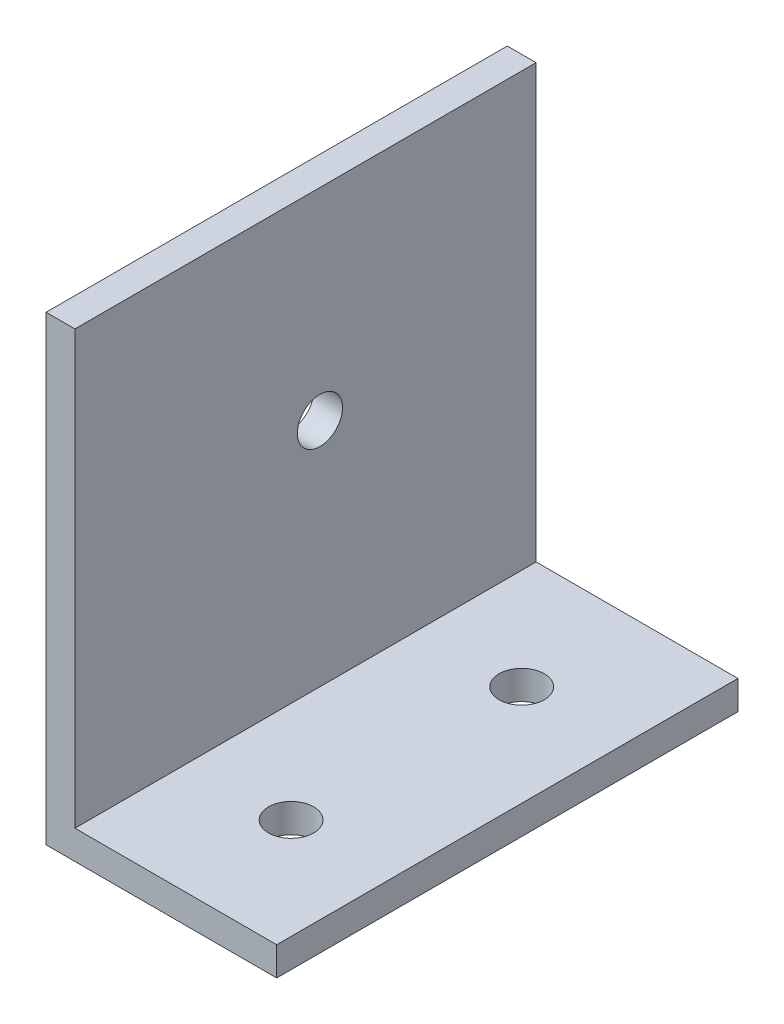
ISO-10303-21;
HEADER;
FILE_DESCRIPTION(('STEP AP214'),'2;1');
FILE_NAME('part.step','',(''),(''),'','','');
FILE_SCHEMA(('AUTOMOTIVE_DESIGN { 1 0 10303 214 1 1 1 1 }'));
ENDSEC;
DATA;
#1=APPLICATION_CONTEXT('core data for automotive mechanical design processes');
#2=APPLICATION_PROTOCOL_DEFINITION('international standard','automotive_design',2000,#1);
#3=PRODUCT_CONTEXT('',#1,'mechanical');
#4=PRODUCT('Part','Part','',(#3));
#5=PRODUCT_RELATED_PRODUCT_CATEGORY('part','',(#4));
#6=PRODUCT_DEFINITION_FORMATION('','',#4);
#7=PRODUCT_DEFINITION_CONTEXT('part definition',#1,'design');
#8=PRODUCT_DEFINITION('design','',#6,#7);
#9=PRODUCT_DEFINITION_SHAPE('','',#8);
#10=(LENGTH_UNIT() NAMED_UNIT(*) SI_UNIT(.MILLI.,.METRE.));
#11=(NAMED_UNIT(*) PLANE_ANGLE_UNIT() SI_UNIT($,.RADIAN.));
#12=(NAMED_UNIT(*) SI_UNIT($,.STERADIAN.) SOLID_ANGLE_UNIT());
#13=UNCERTAINTY_MEASURE_WITH_UNIT(LENGTH_MEASURE(1.E-05),#10,'distance_accuracy_value','');
#14=(GEOMETRIC_REPRESENTATION_CONTEXT(3) GLOBAL_UNCERTAINTY_ASSIGNED_CONTEXT((#13)) GLOBAL_UNIT_ASSIGNED_CONTEXT((#10,
#11,#12)) REPRESENTATION_CONTEXT('',''));
#15=CARTESIAN_POINT('',(0.,0.,0.));
#16=DIRECTION('',(0.,0.,1.));
#17=DIRECTION('',(1.,0.,0.));
#18=AXIS2_PLACEMENT_3D('',#15,#16,#17);
#19=CARTESIAN_POINT('',(25.4,0.,50.8));
#20=DIRECTION('',(0.,1.,0.));
#21=DIRECTION('',(-1.,0.,0.));
#22=AXIS2_PLACEMENT_3D('',#19,#20,#21);
#23=PLANE('',#22);
#24=CARTESIAN_POINT('',(14.2875,0.,38.1));
#25=DIRECTION('',(0.,1.,0.));
#26=DIRECTION('',(0.,0.,1.));
#27=AXIS2_PLACEMENT_3D('',#24,#25,#26);
#28=CIRCLE('',#27,2.4892);
#29=CARTESIAN_POINT('',(14.2875,0.,40.5892));
#30=VERTEX_POINT('',#29);
#31=EDGE_CURVE('E164',#30,#30,#28,.T.);
#32=ORIENTED_EDGE('',*,*,#31,.T.);
#33=EDGE_LOOP('',(#32));
#34=FACE_BOUND('',#33,.T.);
#35=CARTESIAN_POINT('',(14.2875,0.,12.7));
#36=DIRECTION('',(0.,1.,0.));
#37=DIRECTION('',(0.,0.,1.));
#38=AXIS2_PLACEMENT_3D('',#35,#36,#37);
#39=CIRCLE('',#38,2.4892);
#40=CARTESIAN_POINT('',(14.2875,0.,15.1892));
#41=VERTEX_POINT('',#40);
#42=EDGE_CURVE('E172',#41,#41,#39,.T.);
#43=ORIENTED_EDGE('',*,*,#42,.T.);
#44=EDGE_LOOP('',(#43));
#45=FACE_BOUND('',#44,.T.);
#46=DIRECTION('',(1.,0.,0.));
#47=VECTOR('',#46,1.);
#48=CARTESIAN_POINT('',(25.4,0.,0.));
#49=LINE('',#48,#47);
#50=CARTESIAN_POINT('',(0.,0.,0.));
#51=VERTEX_POINT('',#50);
#52=CARTESIAN_POINT('',(25.4,0.,0.));
#53=VERTEX_POINT('',#52);
#54=EDGE_CURVE('E135',#51,#53,#49,.T.);
#55=ORIENTED_EDGE('',*,*,#54,.T.);
#56=DIRECTION('',(0.,0.,-1.));
#57=VECTOR('',#56,1.);
#58=CARTESIAN_POINT('',(25.4,0.,50.8));
#59=LINE('',#58,#57);
#60=CARTESIAN_POINT('',(25.4,0.,50.8));
#61=VERTEX_POINT('',#60);
#62=EDGE_CURVE('E11',#61,#53,#59,.T.);
#63=ORIENTED_EDGE('',*,*,#62,.F.);
#64=DIRECTION('',(1.,0.,0.));
#65=VECTOR('',#64,1.);
#66=CARTESIAN_POINT('',(25.4,0.,50.8));
#67=LINE('',#66,#65);
#68=CARTESIAN_POINT('',(0.,0.,50.8));
#69=VERTEX_POINT('',#68);
#70=EDGE_CURVE('E152',#69,#61,#67,.T.);
#71=ORIENTED_EDGE('',*,*,#70,.F.);
#72=DIRECTION('',(0.,0.,-1.));
#73=VECTOR('',#72,1.);
#74=CARTESIAN_POINT('',(0.,0.,50.8));
#75=LINE('',#74,#73);
#76=EDGE_CURVE('E131',#69,#51,#75,.T.);
#77=ORIENTED_EDGE('',*,*,#76,.T.);
#78=EDGE_LOOP('',(#55,#63,#71,#77));
#79=FACE_BOUND('',#78,.T.);
#80=ADVANCED_FACE('F44',(#34,#45,#79),#23,.F.);
#81=CARTESIAN_POINT('',(25.4,3.175,50.8));
#82=DIRECTION('',(-1.,0.,0.));
#83=DIRECTION('',(0.,0.,1.));
#84=AXIS2_PLACEMENT_3D('',#81,#82,#83);
#85=PLANE('',#84);
#86=DIRECTION('',(0.,1.,0.));
#87=VECTOR('',#86,1.);
#88=CARTESIAN_POINT('',(25.4,3.175,0.));
#89=LINE('',#88,#87);
#90=CARTESIAN_POINT('',(25.4,3.175,0.));
#91=VERTEX_POINT('',#90);
#92=EDGE_CURVE('E139',#53,#91,#89,.T.);
#93=ORIENTED_EDGE('',*,*,#92,.T.);
#94=DIRECTION('',(0.,0.,-1.));
#95=VECTOR('',#94,1.);
#96=CARTESIAN_POINT('',(25.4,3.175,50.8));
#97=LINE('',#96,#95);
#98=CARTESIAN_POINT('',(25.4,3.175,50.8));
#99=VERTEX_POINT('',#98);
#100=EDGE_CURVE('E54',#99,#91,#97,.T.);
#101=ORIENTED_EDGE('',*,*,#100,.F.);
#102=DIRECTION('',(0.,1.,0.));
#103=VECTOR('',#102,1.);
#104=CARTESIAN_POINT('',(25.4,3.175,50.8));
#105=LINE('',#104,#103);
#106=EDGE_CURVE('E100',#61,#99,#105,.T.);
#107=ORIENTED_EDGE('',*,*,#106,.F.);
#108=ORIENTED_EDGE('',*,*,#62,.T.);
#109=EDGE_LOOP('',(#93,#101,#107,#108));
#110=FACE_BOUND('',#109,.T.);
#111=ADVANCED_FACE('F192',(#110),#85,.F.);
#112=CARTESIAN_POINT('',(3.175,3.175,50.8));
#113=DIRECTION('',(0.,-1.,0.));
#114=DIRECTION('',(0.,0.,-1.));
#115=AXIS2_PLACEMENT_3D('',#112,#113,#114);
#116=PLANE('',#115);
#117=CARTESIAN_POINT('',(14.2875,3.175,38.1));
#118=DIRECTION('',(0.,-1.,0.));
#119=DIRECTION('',(0.,0.,-1.));
#120=AXIS2_PLACEMENT_3D('',#117,#118,#119);
#121=CIRCLE('',#120,2.4892);
#122=CARTESIAN_POINT('',(14.2875,3.175,35.6108));
#123=VERTEX_POINT('',#122);
#124=EDGE_CURVE('E47',#123,#123,#121,.F.);
#125=ORIENTED_EDGE('',*,*,#124,.F.);
#126=EDGE_LOOP('',(#125));
#127=FACE_BOUND('',#126,.T.);
#128=CARTESIAN_POINT('',(14.2875,3.175,12.7));
#129=DIRECTION('',(0.,-1.,0.));
#130=DIRECTION('',(0.,0.,-1.));
#131=AXIS2_PLACEMENT_3D('',#128,#129,#130);
#132=CIRCLE('',#131,2.4892);
#133=CARTESIAN_POINT('',(14.2875,3.175,10.2108));
#134=VERTEX_POINT('',#133);
#135=EDGE_CURVE('E161',#134,#134,#132,.F.);
#136=ORIENTED_EDGE('',*,*,#135,.F.);
#137=EDGE_LOOP('',(#136));
#138=FACE_BOUND('',#137,.T.);
#139=DIRECTION('',(-1.,0.,0.));
#140=VECTOR('',#139,1.);
#141=CARTESIAN_POINT('',(3.175,3.175,0.));
#142=LINE('',#141,#140);
#143=CARTESIAN_POINT('',(3.175,3.175,0.));
#144=VERTEX_POINT('',#143);
#145=EDGE_CURVE('E143',#91,#144,#142,.T.);
#146=ORIENTED_EDGE('',*,*,#145,.T.);
#147=DIRECTION('',(0.,0.,-1.));
#148=VECTOR('',#147,1.);
#149=CARTESIAN_POINT('',(3.175,3.175,50.8));
#150=LINE('',#149,#148);
#151=CARTESIAN_POINT('',(3.175,3.175,50.8));
#152=VERTEX_POINT('',#151);
#153=EDGE_CURVE('E124',#152,#144,#150,.T.);
#154=ORIENTED_EDGE('',*,*,#153,.F.);
#155=DIRECTION('',(-1.,0.,0.));
#156=VECTOR('',#155,1.);
#157=CARTESIAN_POINT('',(3.175,3.175,50.8));
#158=LINE('',#157,#156);
#159=EDGE_CURVE('E113',#99,#152,#158,.T.);
#160=ORIENTED_EDGE('',*,*,#159,.F.);
#161=ORIENTED_EDGE('',*,*,#100,.T.);
#162=EDGE_LOOP('',(#146,#154,#160,#161));
#163=FACE_BOUND('',#162,.T.);
#164=ADVANCED_FACE('F195',(#127,#138,#163),#116,.F.);
#165=CARTESIAN_POINT('',(3.175,50.8,50.8));
#166=DIRECTION('',(-1.,0.,0.));
#167=DIRECTION('',(0.,-1.,0.));
#168=AXIS2_PLACEMENT_3D('',#165,#166,#167);
#169=PLANE('',#168);
#170=CARTESIAN_POINT('',(3.175,28.575,23.8125));
#171=DIRECTION('',(-1.,0.,0.));
#172=DIRECTION('',(0.,-1.,0.));
#173=AXIS2_PLACEMENT_3D('',#170,#171,#172);
#174=CIRCLE('',#173,2.4892);
#175=CARTESIAN_POINT('',(3.175,26.0858,23.8125));
#176=VERTEX_POINT('',#175);
#177=EDGE_CURVE('E140',#176,#176,#174,.F.);
#178=ORIENTED_EDGE('',*,*,#177,.F.);
#179=EDGE_LOOP('',(#178));
#180=FACE_BOUND('',#179,.T.);
#181=DIRECTION('',(0.,1.,0.));
#182=VECTOR('',#181,1.);
#183=CARTESIAN_POINT('',(3.175,50.8,0.));
#184=LINE('',#183,#182);
#185=CARTESIAN_POINT('',(3.175,50.8,0.));
#186=VERTEX_POINT('',#185);
#187=EDGE_CURVE('E122',#144,#186,#184,.T.);
#188=ORIENTED_EDGE('',*,*,#187,.T.);
#189=DIRECTION('',(0.,0.,-1.));
#190=VECTOR('',#189,1.);
#191=CARTESIAN_POINT('',(3.175,50.8,50.8));
#192=LINE('',#191,#190);
#193=CARTESIAN_POINT('',(3.175,50.8,50.8));
#194=VERTEX_POINT('',#193);
#195=EDGE_CURVE('E119',#194,#186,#192,.T.);
#196=ORIENTED_EDGE('',*,*,#195,.F.);
#197=DIRECTION('',(0.,1.,0.));
#198=VECTOR('',#197,1.);
#199=CARTESIAN_POINT('',(3.175,50.8,50.8));
#200=LINE('',#199,#198);
#201=EDGE_CURVE('E107',#152,#194,#200,.T.);
#202=ORIENTED_EDGE('',*,*,#201,.F.);
#203=ORIENTED_EDGE('',*,*,#153,.T.);
#204=EDGE_LOOP('',(#188,#196,#202,#203));
#205=FACE_BOUND('',#204,.T.);
#206=ADVANCED_FACE('F120',(#180,#205),#169,.F.);
#207=CARTESIAN_POINT('',(0.,50.8,50.8));
#208=DIRECTION('',(0.,-1.,0.));
#209=DIRECTION('',(0.,0.,-1.));
#210=AXIS2_PLACEMENT_3D('',#207,#208,#209);
#211=PLANE('',#210);
#212=DIRECTION('',(-1.,0.,0.));
#213=VECTOR('',#212,1.);
#214=CARTESIAN_POINT('',(0.,50.8,0.));
#215=LINE('',#214,#213);
#216=CARTESIAN_POINT('',(0.,50.8,0.));
#217=VERTEX_POINT('',#216);
#218=EDGE_CURVE('E86',#186,#217,#215,.T.);
#219=ORIENTED_EDGE('',*,*,#218,.T.);
#220=DIRECTION('',(0.,0.,-1.));
#221=VECTOR('',#220,1.);
#222=CARTESIAN_POINT('',(0.,50.8,50.8));
#223=LINE('',#222,#221);
#224=CARTESIAN_POINT('',(0.,50.8,50.8));
#225=VERTEX_POINT('',#224);
#226=EDGE_CURVE('E125',#225,#217,#223,.T.);
#227=ORIENTED_EDGE('',*,*,#226,.F.);
#228=DIRECTION('',(-1.,0.,0.));
#229=VECTOR('',#228,1.);
#230=CARTESIAN_POINT('',(0.,50.8,50.8));
#231=LINE('',#230,#229);
#232=EDGE_CURVE('E111',#194,#225,#231,.T.);
#233=ORIENTED_EDGE('',*,*,#232,.F.);
#234=ORIENTED_EDGE('',*,*,#195,.T.);
#235=EDGE_LOOP('',(#219,#227,#233,#234));
#236=FACE_BOUND('',#235,.T.);
#237=ADVANCED_FACE('F127',(#236),#211,.F.);
#238=CARTESIAN_POINT('',(0.,0.,50.8));
#239=DIRECTION('',(1.,0.,0.));
#240=DIRECTION('',(0.,0.,-1.));
#241=AXIS2_PLACEMENT_3D('',#238,#239,#240);
#242=PLANE('',#241);
#243=CARTESIAN_POINT('',(0.,28.575,23.8125));
#244=DIRECTION('',(1.,0.,0.));
#245=DIRECTION('',(0.,0.,-1.));
#246=AXIS2_PLACEMENT_3D('',#243,#244,#245);
#247=CIRCLE('',#246,2.4892);
#248=CARTESIAN_POINT('',(0.,28.575,21.3233));
#249=VERTEX_POINT('',#248);
#250=EDGE_CURVE('E170',#249,#249,#247,.T.);
#251=ORIENTED_EDGE('',*,*,#250,.T.);
#252=EDGE_LOOP('',(#251));
#253=FACE_BOUND('',#252,.T.);
#254=DIRECTION('',(0.,-1.,0.));
#255=VECTOR('',#254,1.);
#256=CARTESIAN_POINT('',(0.,0.,0.));
#257=LINE('',#256,#255);
#258=EDGE_CURVE('E92',#217,#51,#257,.T.);
#259=ORIENTED_EDGE('',*,*,#258,.T.);
#260=ORIENTED_EDGE('',*,*,#76,.F.);
#261=DIRECTION('',(0.,-1.,0.));
#262=VECTOR('',#261,1.);
#263=CARTESIAN_POINT('',(0.,0.,50.8));
#264=LINE('',#263,#262);
#265=EDGE_CURVE('E63',#225,#69,#264,.T.);
#266=ORIENTED_EDGE('',*,*,#265,.F.);
#267=ORIENTED_EDGE('',*,*,#226,.T.);
#268=EDGE_LOOP('',(#259,#260,#266,#267));
#269=FACE_BOUND('',#268,.T.);
#270=ADVANCED_FACE('F200',(#253,#269),#242,.F.);
#271=CARTESIAN_POINT('',(0.,0.,50.8));
#272=DIRECTION('',(0.,0.,-1.));
#273=DIRECTION('',(-1.,0.,0.));
#274=AXIS2_PLACEMENT_3D('',#271,#272,#273);
#275=PLANE('',#274);
#276=ORIENTED_EDGE('',*,*,#70,.T.);
#277=ORIENTED_EDGE('',*,*,#106,.T.);
#278=ORIENTED_EDGE('',*,*,#159,.T.);
#279=ORIENTED_EDGE('',*,*,#201,.T.);
#280=ORIENTED_EDGE('',*,*,#232,.T.);
#281=ORIENTED_EDGE('',*,*,#265,.T.);
#282=EDGE_LOOP('',(#276,#277,#278,#279,#280,#281));
#283=FACE_BOUND('',#282,.T.);
#284=ADVANCED_FACE('F109',(#283),#275,.F.);
#285=CARTESIAN_POINT('',(0.,0.,0.));
#286=DIRECTION('',(0.,0.,-1.));
#287=DIRECTION('',(-1.,0.,0.));
#288=AXIS2_PLACEMENT_3D('',#285,#286,#287);
#289=PLANE('',#288);
#290=ORIENTED_EDGE('',*,*,#54,.F.);
#291=ORIENTED_EDGE('',*,*,#258,.F.);
#292=ORIENTED_EDGE('',*,*,#218,.F.);
#293=ORIENTED_EDGE('',*,*,#187,.F.);
#294=ORIENTED_EDGE('',*,*,#145,.F.);
#295=ORIENTED_EDGE('',*,*,#92,.F.);
#296=EDGE_LOOP('',(#290,#291,#292,#293,#294,#295));
#297=FACE_BOUND('',#296,.T.);
#298=ADVANCED_FACE('F198',(#297),#289,.T.);
#299=CARTESIAN_POINT('',(25.4,28.575,23.8125));
#300=DIRECTION('',(-1.,0.,0.));
#301=DIRECTION('',(0.,0.,1.));
#302=AXIS2_PLACEMENT_3D('',#299,#300,#301);
#303=CYLINDRICAL_SURFACE('',#302,2.4892);
#304=ORIENTED_EDGE('',*,*,#250,.F.);
#305=EDGE_LOOP('',(#304));
#306=FACE_BOUND('',#305,.T.);
#307=ORIENTED_EDGE('',*,*,#177,.T.);
#308=EDGE_LOOP('',(#307));
#309=FACE_BOUND('',#308,.T.);
#310=ADVANCED_FACE('F224',(#306,#309),#303,.F.);
#311=CARTESIAN_POINT('',(14.2875,50.8,12.7));
#312=DIRECTION('',(0.,-1.,0.));
#313=DIRECTION('',(0.,0.,-1.));
#314=AXIS2_PLACEMENT_3D('',#311,#312,#313);
#315=CYLINDRICAL_SURFACE('',#314,2.4892);
#316=ORIENTED_EDGE('',*,*,#42,.F.);
#317=EDGE_LOOP('',(#316));
#318=FACE_BOUND('',#317,.T.);
#319=ORIENTED_EDGE('',*,*,#135,.T.);
#320=EDGE_LOOP('',(#319));
#321=FACE_BOUND('',#320,.T.);
#322=ADVANCED_FACE('F221',(#318,#321),#315,.F.);
#323=CARTESIAN_POINT('',(14.2875,50.8,38.1));
#324=DIRECTION('',(0.,-1.,0.));
#325=DIRECTION('',(0.,0.,-1.));
#326=AXIS2_PLACEMENT_3D('',#323,#324,#325);
#327=CYLINDRICAL_SURFACE('',#326,2.4892);
#328=ORIENTED_EDGE('',*,*,#31,.F.);
#329=EDGE_LOOP('',(#328));
#330=FACE_BOUND('',#329,.T.);
#331=ORIENTED_EDGE('',*,*,#124,.T.);
#332=EDGE_LOOP('',(#331));
#333=FACE_BOUND('',#332,.T.);
#334=ADVANCED_FACE('F223',(#330,#333),#327,.F.);
#335=CLOSED_SHELL('',(#80,#111,#164,#206,#237,#270,#284,#298,#310,#322,#334));
#336=MANIFOLD_SOLID_BREP('B2',#335);
#337=ADVANCED_BREP_SHAPE_REPRESENTATION('',(#18,#336),#14);
#338=SHAPE_DEFINITION_REPRESENTATION(#9,#337);
ENDSEC;
END-ISO-10303-21;
